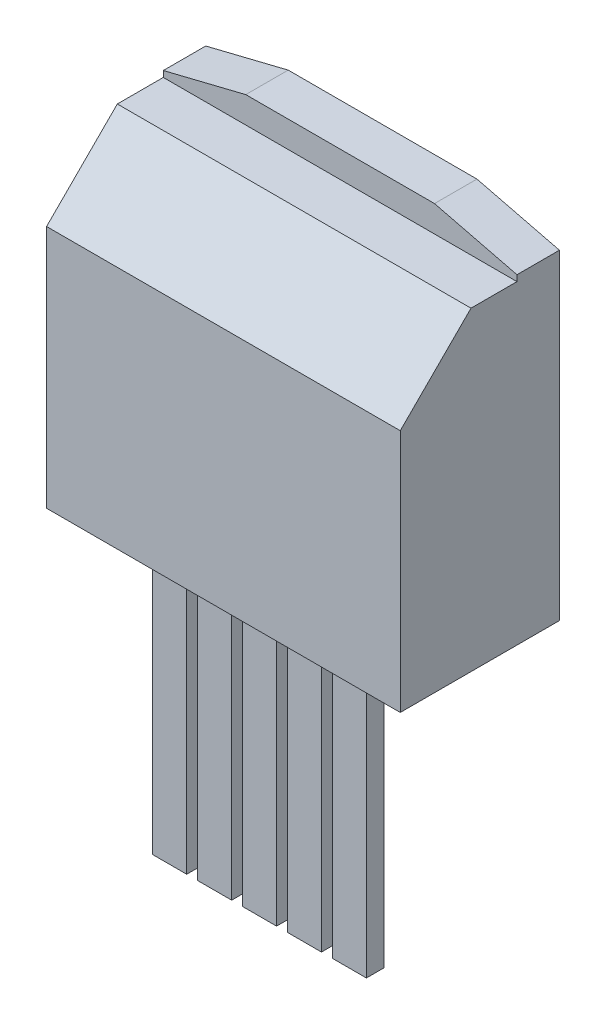
ISO-10303-21;
HEADER;
FILE_DESCRIPTION(('STEP AP214'),'2;1');
FILE_NAME('part.step','',(''),(''),'','','');
FILE_SCHEMA(('AUTOMOTIVE_DESIGN { 1 0 10303 214 1 1 1 1 }'));
ENDSEC;
DATA;
#1=APPLICATION_CONTEXT('core data for automotive mechanical design processes');
#2=APPLICATION_PROTOCOL_DEFINITION('international standard','automotive_design',2000,#1);
#3=PRODUCT_CONTEXT('',#1,'mechanical');
#4=PRODUCT('Part','Part','',(#3));
#5=PRODUCT_RELATED_PRODUCT_CATEGORY('part','',(#4));
#6=PRODUCT_DEFINITION_FORMATION('','',#4);
#7=PRODUCT_DEFINITION_CONTEXT('part definition',#1,'design');
#8=PRODUCT_DEFINITION('design','',#6,#7);
#9=PRODUCT_DEFINITION_SHAPE('','',#8);
#10=(LENGTH_UNIT() NAMED_UNIT(*) SI_UNIT(.MILLI.,.METRE.));
#11=(NAMED_UNIT(*) PLANE_ANGLE_UNIT() SI_UNIT($,.RADIAN.));
#12=(NAMED_UNIT(*) SI_UNIT($,.STERADIAN.) SOLID_ANGLE_UNIT());
#13=UNCERTAINTY_MEASURE_WITH_UNIT(LENGTH_MEASURE(1.E-05),#10,'distance_accuracy_value','');
#14=(GEOMETRIC_REPRESENTATION_CONTEXT(3) GLOBAL_UNCERTAINTY_ASSIGNED_CONTEXT((#13)) GLOBAL_UNIT_ASSIGNED_CONTEXT((#10,
#11,#12)) REPRESENTATION_CONTEXT('',''));
#15=CARTESIAN_POINT('',(0.,0.,0.));
#16=DIRECTION('',(0.,0.,1.));
#17=DIRECTION('',(1.,0.,0.));
#18=AXIS2_PLACEMENT_3D('',#15,#16,#17);
#19=CARTESIAN_POINT('',(-5.,0.,4.5));
#20=DIRECTION('',(0.,1.,0.));
#21=DIRECTION('',(-1.,0.,0.));
#22=AXIS2_PLACEMENT_3D('',#19,#20,#21);
#23=PLANE('',#22);
#24=DIRECTION('',(0.,0.,-1.));
#25=VECTOR('',#24,1.);
#26=CARTESIAN_POINT('',(-3.0227987588892,0.,3.47999999999991));
#27=LINE('',#26,#25);
#28=CARTESIAN_POINT('',(-3.0227987588892,0.,3.47999999999991));
#29=VERTEX_POINT('',#28);
#30=CARTESIAN_POINT('',(-3.0227987588892,0.,2.97999999999991));
#31=VERTEX_POINT('',#30);
#32=EDGE_CURVE('E248',#29,#31,#27,.T.);
#33=ORIENTED_EDGE('',*,*,#32,.F.);
#34=DIRECTION('',(-1.,0.,0.));
#35=VECTOR('',#34,1.);
#36=CARTESIAN_POINT('',(-3.0227987588892,0.,3.47999999999991));
#37=LINE('',#36,#35);
#38=CARTESIAN_POINT('',(-2.0572012411108,0.,3.47999999999991));
#39=VERTEX_POINT('',#38);
#40=EDGE_CURVE('E261',#39,#29,#37,.T.);
#41=ORIENTED_EDGE('',*,*,#40,.F.);
#42=DIRECTION('',(0.,0.,1.));
#43=VECTOR('',#42,1.);
#44=CARTESIAN_POINT('',(-2.0572012411108,0.,3.47999999999991));
#45=LINE('',#44,#43);
#46=CARTESIAN_POINT('',(-2.0572012411108,0.,2.97999999999991));
#47=VERTEX_POINT('',#46);
#48=EDGE_CURVE('E270',#47,#39,#45,.T.);
#49=ORIENTED_EDGE('',*,*,#48,.F.);
#50=DIRECTION('',(1.,0.,0.));
#51=VECTOR('',#50,1.);
#52=CARTESIAN_POINT('',(-3.0227987588892,0.,2.97999999999991));
#53=LINE('',#52,#51);
#54=EDGE_CURVE('E251',#31,#47,#53,.T.);
#55=ORIENTED_EDGE('',*,*,#54,.F.);
#56=EDGE_LOOP('',(#33,#41,#49,#55));
#57=FACE_BOUND('',#56,.T.);
#58=DIRECTION('',(0.,0.,-1.));
#59=VECTOR('',#58,1.);
#60=CARTESIAN_POINT('',(0.787201241110799,0.,3.48));
#61=LINE('',#60,#59);
#62=CARTESIAN_POINT('',(0.787201241110799,0.,3.48));
#63=VERTEX_POINT('',#62);
#64=CARTESIAN_POINT('',(0.787201241110798,0.,2.98));
#65=VERTEX_POINT('',#64);
#66=EDGE_CURVE('E319',#63,#65,#61,.T.);
#67=ORIENTED_EDGE('',*,*,#66,.F.);
#68=DIRECTION('',(-1.,0.,0.));
#69=VECTOR('',#68,1.);
#70=CARTESIAN_POINT('',(0.787201241110799,0.,3.48));
#71=LINE('',#70,#69);
#72=CARTESIAN_POINT('',(1.7527987588892,0.,3.48));
#73=VERTEX_POINT('',#72);
#74=EDGE_CURVE('E324',#73,#63,#71,.T.);
#75=ORIENTED_EDGE('',*,*,#74,.F.);
#76=DIRECTION('',(0.,0.,1.));
#77=VECTOR('',#76,1.);
#78=CARTESIAN_POINT('',(1.7527987588892,0.,3.48));
#79=LINE('',#78,#77);
#80=CARTESIAN_POINT('',(1.7527987588892,0.,2.98));
#81=VERTEX_POINT('',#80);
#82=EDGE_CURVE('E336',#81,#73,#79,.T.);
#83=ORIENTED_EDGE('',*,*,#82,.F.);
#84=DIRECTION('',(1.,0.,0.));
#85=VECTOR('',#84,1.);
#86=CARTESIAN_POINT('',(0.787201241110799,0.,2.98));
#87=LINE('',#86,#85);
#88=EDGE_CURVE('E333',#65,#81,#87,.T.);
#89=ORIENTED_EDGE('',*,*,#88,.F.);
#90=EDGE_LOOP('',(#67,#75,#83,#89));
#91=FACE_BOUND('',#90,.T.);
#92=DIRECTION('',(1.,0.,0.));
#93=VECTOR('',#92,1.);
#94=CARTESIAN_POINT('',(-5.,0.,0.));
#95=LINE('',#94,#93);
#96=CARTESIAN_POINT('',(-5.,0.,0.));
#97=VERTEX_POINT('',#96);
#98=CARTESIAN_POINT('',(5.,0.,0.));
#99=VERTEX_POINT('',#98);
#100=EDGE_CURVE('E435',#97,#99,#95,.T.);
#101=ORIENTED_EDGE('',*,*,#100,.T.);
#102=DIRECTION('',(0.,0.,-1.));
#103=VECTOR('',#102,1.);
#104=CARTESIAN_POINT('',(5.,0.,4.5));
#105=LINE('',#104,#103);
#106=CARTESIAN_POINT('',(5.,0.,4.5));
#107=VERTEX_POINT('',#106);
#108=EDGE_CURVE('E433',#107,#99,#105,.T.);
#109=ORIENTED_EDGE('',*,*,#108,.F.);
#110=DIRECTION('',(1.,0.,0.));
#111=VECTOR('',#110,1.);
#112=CARTESIAN_POINT('',(-5.,0.,4.5));
#113=LINE('',#112,#111);
#114=CARTESIAN_POINT('',(-5.,0.,4.5));
#115=VERTEX_POINT('',#114);
#116=EDGE_CURVE('E427',#115,#107,#113,.T.);
#117=ORIENTED_EDGE('',*,*,#116,.F.);
#118=DIRECTION('',(0.,0.,-1.));
#119=VECTOR('',#118,1.);
#120=CARTESIAN_POINT('',(-5.,0.,4.5));
#121=LINE('',#120,#119);
#122=EDGE_CURVE('E441',#115,#97,#121,.T.);
#123=ORIENTED_EDGE('',*,*,#122,.T.);
#124=EDGE_LOOP('',(#101,#109,#117,#123));
#125=FACE_BOUND('',#124,.T.);
#126=DIRECTION('',(0.,0.,-1.));
#127=VECTOR('',#126,1.);
#128=CARTESIAN_POINT('',(-0.482798758889201,0.,3.48));
#129=LINE('',#128,#127);
#130=CARTESIAN_POINT('',(-0.482798758889201,0.,3.48));
#131=VERTEX_POINT('',#130);
#132=CARTESIAN_POINT('',(-0.482798758889201,0.,2.98));
#133=VERTEX_POINT('',#132);
#134=EDGE_CURVE('E352',#131,#133,#129,.T.);
#135=ORIENTED_EDGE('',*,*,#134,.F.);
#136=DIRECTION('',(-1.,0.,0.));
#137=VECTOR('',#136,1.);
#138=CARTESIAN_POINT('',(-0.482798758889201,0.,3.48));
#139=LINE('',#138,#137);
#140=CARTESIAN_POINT('',(0.482798758889203,0.,3.48));
#141=VERTEX_POINT('',#140);
#142=EDGE_CURVE('E357',#141,#131,#139,.T.);
#143=ORIENTED_EDGE('',*,*,#142,.F.);
#144=DIRECTION('',(0.,0.,1.));
#145=VECTOR('',#144,1.);
#146=CARTESIAN_POINT('',(0.482798758889201,0.,3.48));
#147=LINE('',#146,#145);
#148=CARTESIAN_POINT('',(0.482798758889201,0.,2.98));
#149=VERTEX_POINT('',#148);
#150=EDGE_CURVE('E369',#149,#141,#147,.T.);
#151=ORIENTED_EDGE('',*,*,#150,.F.);
#152=DIRECTION('',(1.,0.,0.));
#153=VECTOR('',#152,1.);
#154=CARTESIAN_POINT('',(-0.482798758889201,0.,2.98));
#155=LINE('',#154,#153);
#156=EDGE_CURVE('E366',#133,#149,#155,.T.);
#157=ORIENTED_EDGE('',*,*,#156,.F.);
#158=EDGE_LOOP('',(#135,#143,#151,#157));
#159=FACE_BOUND('',#158,.T.);
#160=DIRECTION('',(0.,0.,-1.));
#161=VECTOR('',#160,1.);
#162=CARTESIAN_POINT('',(-1.7527987588892,0.,3.47999999999996));
#163=LINE('',#162,#161);
#164=CARTESIAN_POINT('',(-1.7527987588892,0.,3.47999999999996));
#165=VERTEX_POINT('',#164);
#166=CARTESIAN_POINT('',(-1.7527987588892,0.,2.97999999999996));
#167=VERTEX_POINT('',#166);
#168=EDGE_CURVE('E286',#165,#167,#163,.T.);
#169=ORIENTED_EDGE('',*,*,#168,.F.);
#170=DIRECTION('',(-1.,0.,0.));
#171=VECTOR('',#170,1.);
#172=CARTESIAN_POINT('',(-1.7527987588892,0.,3.47999999999996));
#173=LINE('',#172,#171);
#174=CARTESIAN_POINT('',(-0.787201241110797,0.,3.47999999999996));
#175=VERTEX_POINT('',#174);
#176=EDGE_CURVE('E291',#175,#165,#173,.T.);
#177=ORIENTED_EDGE('',*,*,#176,.F.);
#178=DIRECTION('',(0.,0.,1.));
#179=VECTOR('',#178,1.);
#180=CARTESIAN_POINT('',(-0.787201241110799,0.,3.47999999999996));
#181=LINE('',#180,#179);
#182=CARTESIAN_POINT('',(-0.787201241110799,0.,2.97999999999996));
#183=VERTEX_POINT('',#182);
#184=EDGE_CURVE('E303',#183,#175,#181,.T.);
#185=ORIENTED_EDGE('',*,*,#184,.F.);
#186=DIRECTION('',(1.,0.,0.));
#187=VECTOR('',#186,1.);
#188=CARTESIAN_POINT('',(-1.7527987588892,0.,2.97999999999996));
#189=LINE('',#188,#187);
#190=EDGE_CURVE('E300',#167,#183,#189,.T.);
#191=ORIENTED_EDGE('',*,*,#190,.F.);
#192=EDGE_LOOP('',(#169,#177,#185,#191));
#193=FACE_BOUND('',#192,.T.);
#194=DIRECTION('',(0.,0.,-1.));
#195=VECTOR('',#194,1.);
#196=CARTESIAN_POINT('',(2.0572012411108,0.,3.48));
#197=LINE('',#196,#195);
#198=CARTESIAN_POINT('',(2.0572012411108,0.,3.48));
#199=VERTEX_POINT('',#198);
#200=CARTESIAN_POINT('',(2.0572012411108,0.,2.98));
#201=VERTEX_POINT('',#200);
#202=EDGE_CURVE('E247',#199,#201,#197,.T.);
#203=ORIENTED_EDGE('',*,*,#202,.F.);
#204=DIRECTION('',(-1.,0.,0.));
#205=VECTOR('',#204,1.);
#206=CARTESIAN_POINT('',(2.0572012411108,0.,3.48));
#207=LINE('',#206,#205);
#208=CARTESIAN_POINT('',(3.0227987588892,0.,3.48));
#209=VERTEX_POINT('',#208);
#210=EDGE_CURVE('E244',#209,#199,#207,.T.);
#211=ORIENTED_EDGE('',*,*,#210,.F.);
#212=DIRECTION('',(0.,0.,1.));
#213=VECTOR('',#212,1.);
#214=CARTESIAN_POINT('',(3.0227987588892,0.,3.48));
#215=LINE('',#214,#213);
#216=CARTESIAN_POINT('',(3.0227987588892,0.,2.98));
#217=VERTEX_POINT('',#216);
#218=EDGE_CURVE('E57',#217,#209,#215,.T.);
#219=ORIENTED_EDGE('',*,*,#218,.F.);
#220=DIRECTION('',(1.,0.,0.));
#221=VECTOR('',#220,1.);
#222=CARTESIAN_POINT('',(2.0572012411108,0.,2.98));
#223=LINE('',#222,#221);
#224=EDGE_CURVE('E52',#201,#217,#223,.T.);
#225=ORIENTED_EDGE('',*,*,#224,.F.);
#226=EDGE_LOOP('',(#203,#211,#219,#225));
#227=FACE_BOUND('',#226,.T.);
#228=ADVANCED_FACE('F37',(#57,#91,#125,#159,#193,#227),#23,.F.);
#229=CARTESIAN_POINT('',(-4.99999999999999,15.4,4.5));
#230=DIRECTION('',(1.,0.,0.));
#231=DIRECTION('',(0.,1.,0.));
#232=AXIS2_PLACEMENT_3D('',#229,#230,#231);
#233=PLANE('',#232);
#234=DIRECTION('',(0.,1.,0.));
#235=VECTOR('',#234,1.);
#236=CARTESIAN_POINT('',(-4.99999999999999,15.4,1.2));
#237=LINE('',#236,#235);
#238=CARTESIAN_POINT('',(-4.99999999999999,8.9,1.2));
#239=VERTEX_POINT('',#238);
#240=CARTESIAN_POINT('',(-5.,9.06956973121704,1.2));
#241=VERTEX_POINT('',#240);
#242=EDGE_CURVE('E414',#239,#241,#237,.T.);
#243=ORIENTED_EDGE('',*,*,#242,.T.);
#244=DIRECTION('',(0.,0.,1.));
#245=VECTOR('',#244,1.);
#246=CARTESIAN_POINT('',(-4.99999999999999,9.06956973121704,-8.8));
#247=LINE('',#246,#245);
#248=CARTESIAN_POINT('',(-4.99999999999999,9.06956973121704,0.));
#249=VERTEX_POINT('',#248);
#250=EDGE_CURVE('E393',#249,#241,#247,.T.);
#251=ORIENTED_EDGE('',*,*,#250,.F.);
#252=DIRECTION('',(0.,-1.,0.));
#253=VECTOR('',#252,1.);
#254=CARTESIAN_POINT('',(-4.99999999999999,15.4,0.));
#255=LINE('',#254,#253);
#256=EDGE_CURVE('E424',#249,#97,#255,.T.);
#257=ORIENTED_EDGE('',*,*,#256,.T.);
#258=ORIENTED_EDGE('',*,*,#122,.F.);
#259=DIRECTION('',(0.,-1.,0.));
#260=VECTOR('',#259,1.);
#261=CARTESIAN_POINT('',(-4.99999999999999,15.4,4.5));
#262=LINE('',#261,#260);
#263=CARTESIAN_POINT('',(-5.,6.89999999999999,4.5));
#264=VERTEX_POINT('',#263);
#265=EDGE_CURVE('E425',#264,#115,#262,.T.);
#266=ORIENTED_EDGE('',*,*,#265,.F.);
#267=DIRECTION('',(0.,0.707106781186549,-0.707106781186546));
#268=VECTOR('',#267,1.);
#269=CARTESIAN_POINT('',(-5.,8.9,2.5));
#270=LINE('',#269,#268);
#271=CARTESIAN_POINT('',(-5.,8.9,2.49999999999999));
#272=VERTEX_POINT('',#271);
#273=EDGE_CURVE('E12',#264,#272,#270,.T.);
#274=ORIENTED_EDGE('',*,*,#273,.T.);
#275=DIRECTION('',(0.,0.,1.));
#276=VECTOR('',#275,1.);
#277=CARTESIAN_POINT('',(-4.99999999999999,8.9,-11.9268604418766));
#278=LINE('',#277,#276);
#279=EDGE_CURVE('E411',#239,#272,#278,.T.);
#280=ORIENTED_EDGE('',*,*,#279,.F.);
#281=EDGE_LOOP('',(#243,#251,#257,#258,#266,#274,#280));
#282=FACE_BOUND('',#281,.T.);
#283=ADVANCED_FACE('F458',(#282),#233,.F.);
#284=CARTESIAN_POINT('',(5.,15.4,4.5));
#285=DIRECTION('',(-1.,0.,0.));
#286=DIRECTION('',(0.,-1.,0.));
#287=AXIS2_PLACEMENT_3D('',#284,#285,#286);
#288=PLANE('',#287);
#289=DIRECTION('',(0.,1.,0.));
#290=VECTOR('',#289,1.);
#291=CARTESIAN_POINT('',(5.,15.4,0.));
#292=LINE('',#291,#290);
#293=CARTESIAN_POINT('',(4.99999999999999,9.06956973121704,0.));
#294=VERTEX_POINT('',#293);
#295=EDGE_CURVE('E428',#99,#294,#292,.T.);
#296=ORIENTED_EDGE('',*,*,#295,.T.);
#297=DIRECTION('',(0.,0.,1.));
#298=VECTOR('',#297,1.);
#299=CARTESIAN_POINT('',(4.99999999999999,9.06956973121704,-8.8));
#300=LINE('',#299,#298);
#301=CARTESIAN_POINT('',(4.99999999999999,9.06956973121704,1.2));
#302=VERTEX_POINT('',#301);
#303=EDGE_CURVE('E394',#294,#302,#300,.T.);
#304=ORIENTED_EDGE('',*,*,#303,.T.);
#305=DIRECTION('',(0.,-1.,0.));
#306=VECTOR('',#305,1.);
#307=CARTESIAN_POINT('',(5.,15.4,1.2));
#308=LINE('',#307,#306);
#309=CARTESIAN_POINT('',(5.,8.9,1.2));
#310=VERTEX_POINT('',#309);
#311=EDGE_CURVE('E412',#302,#310,#308,.T.);
#312=ORIENTED_EDGE('',*,*,#311,.T.);
#313=DIRECTION('',(0.,0.,1.));
#314=VECTOR('',#313,1.);
#315=CARTESIAN_POINT('',(5.,8.9,-11.9268604418766));
#316=LINE('',#315,#314);
#317=CARTESIAN_POINT('',(5.,8.9,2.49999999999999));
#318=VERTEX_POINT('',#317);
#319=EDGE_CURVE('E415',#310,#318,#316,.T.);
#320=ORIENTED_EDGE('',*,*,#319,.T.);
#321=DIRECTION('',(0.,-0.707106781186549,0.707106781186546));
#322=VECTOR('',#321,1.);
#323=CARTESIAN_POINT('',(5.,8.9,2.5));
#324=LINE('',#323,#322);
#325=CARTESIAN_POINT('',(5.,6.89999999999999,4.5));
#326=VERTEX_POINT('',#325);
#327=EDGE_CURVE('E447',#318,#326,#324,.T.);
#328=ORIENTED_EDGE('',*,*,#327,.T.);
#329=DIRECTION('',(0.,1.,0.));
#330=VECTOR('',#329,1.);
#331=CARTESIAN_POINT('',(5.,15.4,4.5));
#332=LINE('',#331,#330);
#333=EDGE_CURVE('E430',#107,#326,#332,.T.);
#334=ORIENTED_EDGE('',*,*,#333,.F.);
#335=ORIENTED_EDGE('',*,*,#108,.T.);
#336=EDGE_LOOP('',(#296,#304,#312,#320,#328,#334,#335));
#337=FACE_BOUND('',#336,.T.);
#338=ADVANCED_FACE('F466',(#337),#288,.F.);
#339=CARTESIAN_POINT('',(0.,0.,4.5));
#340=DIRECTION('',(0.,0.,1.));
#341=DIRECTION('',(1.,0.,0.));
#342=AXIS2_PLACEMENT_3D('',#339,#340,#341);
#343=PLANE('',#342);
#344=ORIENTED_EDGE('',*,*,#333,.T.);
#345=DIRECTION('',(-1.,0.,0.));
#346=VECTOR('',#345,1.);
#347=CARTESIAN_POINT('',(-5.,6.89999999999999,4.5));
#348=LINE('',#347,#346);
#349=EDGE_CURVE('E45',#326,#264,#348,.T.);
#350=ORIENTED_EDGE('',*,*,#349,.T.);
#351=ORIENTED_EDGE('',*,*,#265,.T.);
#352=ORIENTED_EDGE('',*,*,#116,.T.);
#353=EDGE_LOOP('',(#344,#350,#351,#352));
#354=FACE_BOUND('',#353,.T.);
#355=ADVANCED_FACE('F451',(#354),#343,.T.);
#356=CARTESIAN_POINT('',(0.,0.,0.));
#357=DIRECTION('',(0.,0.,1.));
#358=DIRECTION('',(1.,0.,0.));
#359=AXIS2_PLACEMENT_3D('',#356,#357,#358);
#360=PLANE('',#359);
#361=DIRECTION('',(1.,0.,0.));
#362=VECTOR('',#361,1.);
#363=CARTESIAN_POINT('',(0.,9.64535654457429,0.));
#364=LINE('',#363,#362);
#365=CARTESIAN_POINT('',(-2.66802514635821,9.64535654457429,0.));
#366=VERTEX_POINT('',#365);
#367=CARTESIAN_POINT('',(2.66802514635821,9.64535654457429,0.));
#368=VERTEX_POINT('',#367);
#369=EDGE_CURVE('E405',#366,#368,#364,.T.);
#370=ORIENTED_EDGE('',*,*,#369,.T.);
#371=DIRECTION('',(0.970844358785444,-0.239710723611775,0.));
#372=VECTOR('',#371,1.);
#373=CARTESIAN_POINT('',(2.39799278223807,9.71203010848397,0.));
#374=LINE('',#373,#372);
#375=EDGE_CURVE('E408',#368,#294,#374,.T.);
#376=ORIENTED_EDGE('',*,*,#375,.T.);
#377=ORIENTED_EDGE('',*,*,#295,.F.);
#378=ORIENTED_EDGE('',*,*,#100,.F.);
#379=ORIENTED_EDGE('',*,*,#256,.F.);
#380=DIRECTION('',(0.970844358785444,0.239710723611775,0.));
#381=VECTOR('',#380,1.);
#382=CARTESIAN_POINT('',(-2.39799278223807,9.71203010848397,0.));
#383=LINE('',#382,#381);
#384=EDGE_CURVE('E397',#249,#366,#383,.T.);
#385=ORIENTED_EDGE('',*,*,#384,.T.);
#386=EDGE_LOOP('',(#370,#376,#377,#378,#379,#385));
#387=FACE_BOUND('',#386,.T.);
#388=ADVANCED_FACE('F479',(#387),#360,.F.);
#389=CARTESIAN_POINT('',(-4.99999999999999,8.9,-11.9268604418766));
#390=DIRECTION('',(0.,-1.,0.));
#391=DIRECTION('',(0.,0.,-1.));
#392=AXIS2_PLACEMENT_3D('',#389,#390,#391);
#393=PLANE('',#392);
#394=ORIENTED_EDGE('',*,*,#279,.T.);
#395=DIRECTION('',(1.,0.,0.));
#396=VECTOR('',#395,1.);
#397=CARTESIAN_POINT('',(5.,8.9,2.5));
#398=LINE('',#397,#396);
#399=EDGE_CURVE('E444',#272,#318,#398,.T.);
#400=ORIENTED_EDGE('',*,*,#399,.T.);
#401=ORIENTED_EDGE('',*,*,#319,.F.);
#402=DIRECTION('',(-1.,0.,0.));
#403=VECTOR('',#402,1.);
#404=CARTESIAN_POINT('',(-4.99999999999999,8.9,1.2));
#405=LINE('',#404,#403);
#406=EDGE_CURVE('E418',#310,#239,#405,.T.);
#407=ORIENTED_EDGE('',*,*,#406,.T.);
#408=EDGE_LOOP('',(#394,#400,#401,#407));
#409=FACE_BOUND('',#408,.T.);
#410=ADVANCED_FACE('F463',(#409),#393,.F.);
#411=CARTESIAN_POINT('',(0.,0.,1.2));
#412=DIRECTION('',(0.,0.,1.));
#413=DIRECTION('',(1.,0.,0.));
#414=AXIS2_PLACEMENT_3D('',#411,#412,#413);
#415=PLANE('',#414);
#416=DIRECTION('',(0.970844358785444,-0.239710723611775,0.));
#417=VECTOR('',#416,1.);
#418=CARTESIAN_POINT('',(4.99999999999999,9.06956973121704,1.2));
#419=LINE('',#418,#417);
#420=CARTESIAN_POINT('',(2.66802514635821,9.64535654457429,1.2));
#421=VERTEX_POINT('',#420);
#422=EDGE_CURVE('E391',#421,#302,#419,.T.);
#423=ORIENTED_EDGE('',*,*,#422,.F.);
#424=DIRECTION('',(1.,0.,0.));
#425=VECTOR('',#424,1.);
#426=CARTESIAN_POINT('',(-2.66802514635821,9.64535654457429,1.2));
#427=LINE('',#426,#425);
#428=CARTESIAN_POINT('',(-2.66802514635821,9.64535654457429,1.2));
#429=VERTEX_POINT('',#428);
#430=EDGE_CURVE('E388',#429,#421,#427,.T.);
#431=ORIENTED_EDGE('',*,*,#430,.F.);
#432=DIRECTION('',(0.970844358785444,0.239710723611775,0.));
#433=VECTOR('',#432,1.);
#434=CARTESIAN_POINT('',(-4.99999999999999,9.06956973121704,1.2));
#435=LINE('',#434,#433);
#436=EDGE_CURVE('E385',#241,#429,#435,.T.);
#437=ORIENTED_EDGE('',*,*,#436,.F.);
#438=ORIENTED_EDGE('',*,*,#242,.F.);
#439=ORIENTED_EDGE('',*,*,#406,.F.);
#440=ORIENTED_EDGE('',*,*,#311,.F.);
#441=EDGE_LOOP('',(#423,#431,#437,#438,#439,#440));
#442=FACE_BOUND('',#441,.T.);
#443=ADVANCED_FACE('F470',(#442),#415,.T.);
#444=CARTESIAN_POINT('',(-4.99999999999999,8.9,2.5));
#445=DIRECTION('',(0.,0.707106781186546,0.707106781186549));
#446=DIRECTION('',(-1.,0.,0.));
#447=AXIS2_PLACEMENT_3D('',#444,#445,#446);
#448=PLANE('',#447);
#449=ORIENTED_EDGE('',*,*,#273,.F.);
#450=ORIENTED_EDGE('',*,*,#349,.F.);
#451=ORIENTED_EDGE('',*,*,#327,.F.);
#452=ORIENTED_EDGE('',*,*,#399,.F.);
#453=EDGE_LOOP('',(#449,#450,#451,#452));
#454=FACE_BOUND('',#453,.T.);
#455=ADVANCED_FACE('F39',(#454),#448,.T.);
#456=CARTESIAN_POINT('',(4.99999999999999,9.06956973121704,-8.8));
#457=DIRECTION('',(-0.239710723611775,-0.970844358785444,0.));
#458=DIRECTION('',(0.970844358785444,-0.239710723611775,0.));
#459=AXIS2_PLACEMENT_3D('',#456,#457,#458);
#460=PLANE('',#459);
#461=DIRECTION('',(0.,0.,1.));
#462=VECTOR('',#461,1.);
#463=CARTESIAN_POINT('',(2.66802514635821,9.64535654457429,-8.8));
#464=LINE('',#463,#462);
#465=EDGE_CURVE('E398',#368,#421,#464,.T.);
#466=ORIENTED_EDGE('',*,*,#465,.T.);
#467=ORIENTED_EDGE('',*,*,#422,.T.);
#468=ORIENTED_EDGE('',*,*,#303,.F.);
#469=ORIENTED_EDGE('',*,*,#375,.F.);
#470=EDGE_LOOP('',(#466,#467,#468,#469));
#471=FACE_BOUND('',#470,.T.);
#472=ADVANCED_FACE('F596',(#471),#460,.F.);
#473=CARTESIAN_POINT('',(-2.66802514635821,9.64535654457429,-8.8));
#474=DIRECTION('',(0.,-1.,0.));
#475=DIRECTION('',(0.,0.,-1.));
#476=AXIS2_PLACEMENT_3D('',#473,#474,#475);
#477=PLANE('',#476);
#478=DIRECTION('',(0.,0.,1.));
#479=VECTOR('',#478,1.);
#480=CARTESIAN_POINT('',(-2.66802514635821,9.64535654457429,-8.8));
#481=LINE('',#480,#479);
#482=EDGE_CURVE('E400',#366,#429,#481,.T.);
#483=ORIENTED_EDGE('',*,*,#482,.T.);
#484=ORIENTED_EDGE('',*,*,#430,.T.);
#485=ORIENTED_EDGE('',*,*,#465,.F.);
#486=ORIENTED_EDGE('',*,*,#369,.F.);
#487=EDGE_LOOP('',(#483,#484,#485,#486));
#488=FACE_BOUND('',#487,.T.);
#489=ADVANCED_FACE('F599',(#488),#477,.F.);
#490=CARTESIAN_POINT('',(-4.99999999999999,9.06956973121704,-8.8));
#491=DIRECTION('',(0.239710723611775,-0.970844358785444,0.));
#492=DIRECTION('',(0.970844358785444,0.239710723611775,0.));
#493=AXIS2_PLACEMENT_3D('',#490,#491,#492);
#494=PLANE('',#493);
#495=ORIENTED_EDGE('',*,*,#250,.T.);
#496=ORIENTED_EDGE('',*,*,#436,.T.);
#497=ORIENTED_EDGE('',*,*,#482,.F.);
#498=ORIENTED_EDGE('',*,*,#384,.F.);
#499=EDGE_LOOP('',(#495,#496,#497,#498));
#500=FACE_BOUND('',#499,.T.);
#501=ADVANCED_FACE('F594',(#500),#494,.F.);
#502=CARTESIAN_POINT('',(-0.4827987588892,-8.,3.48));
#503=DIRECTION('',(1.,0.,0.));
#504=DIRECTION('',(0.,1.,0.));
#505=AXIS2_PLACEMENT_3D('',#502,#503,#504);
#506=PLANE('',#505);
#507=ORIENTED_EDGE('',*,*,#134,.T.);
#508=DIRECTION('',(0.,1.,0.));
#509=VECTOR('',#508,1.);
#510=CARTESIAN_POINT('',(-0.4827987588892,-8.,2.98));
#511=LINE('',#510,#509);
#512=CARTESIAN_POINT('',(-0.4827987588892,-8.,2.98));
#513=VERTEX_POINT('',#512);
#514=EDGE_CURVE('E382',#513,#133,#511,.T.);
#515=ORIENTED_EDGE('',*,*,#514,.F.);
#516=DIRECTION('',(0.,0.,-1.));
#517=VECTOR('',#516,1.);
#518=CARTESIAN_POINT('',(-0.4827987588892,-8.,3.48));
#519=LINE('',#518,#517);
#520=CARTESIAN_POINT('',(-0.4827987588892,-8.,3.48));
#521=VERTEX_POINT('',#520);
#522=EDGE_CURVE('E353',#521,#513,#519,.T.);
#523=ORIENTED_EDGE('',*,*,#522,.F.);
#524=DIRECTION('',(0.,1.,0.));
#525=VECTOR('',#524,1.);
#526=CARTESIAN_POINT('',(-0.4827987588892,-8.,3.48));
#527=LINE('',#526,#525);
#528=EDGE_CURVE('E363',#521,#131,#527,.T.);
#529=ORIENTED_EDGE('',*,*,#528,.T.);
#530=EDGE_LOOP('',(#507,#515,#523,#529));
#531=FACE_BOUND('',#530,.T.);
#532=ADVANCED_FACE('F590',(#531),#506,.F.);
#533=CARTESIAN_POINT('',(-0.4827987588892,-8.,2.98));
#534=DIRECTION('',(0.,0.,1.));
#535=DIRECTION('',(1.,0.,0.));
#536=AXIS2_PLACEMENT_3D('',#533,#534,#535);
#537=PLANE('',#536);
#538=ORIENTED_EDGE('',*,*,#156,.T.);
#539=DIRECTION('',(0.,1.,0.));
#540=VECTOR('',#539,1.);
#541=CARTESIAN_POINT('',(0.482798758889202,-8.,2.98));
#542=LINE('',#541,#540);
#543=CARTESIAN_POINT('',(0.482798758889202,-8.,2.98));
#544=VERTEX_POINT('',#543);
#545=EDGE_CURVE('E379',#544,#149,#542,.T.);
#546=ORIENTED_EDGE('',*,*,#545,.F.);
#547=DIRECTION('',(1.,0.,0.));
#548=VECTOR('',#547,1.);
#549=CARTESIAN_POINT('',(-0.4827987588892,-8.,2.98));
#550=LINE('',#549,#548);
#551=EDGE_CURVE('E356',#513,#544,#550,.T.);
#552=ORIENTED_EDGE('',*,*,#551,.F.);
#553=ORIENTED_EDGE('',*,*,#514,.T.);
#554=EDGE_LOOP('',(#538,#546,#552,#553));
#555=FACE_BOUND('',#554,.T.);
#556=ADVANCED_FACE('F586',(#555),#537,.F.);
#557=CARTESIAN_POINT('',(0.482798758889202,-8.,3.48));
#558=DIRECTION('',(-1.,0.,0.));
#559=DIRECTION('',(0.,-1.,0.));
#560=AXIS2_PLACEMENT_3D('',#557,#558,#559);
#561=PLANE('',#560);
#562=ORIENTED_EDGE('',*,*,#150,.T.);
#563=DIRECTION('',(0.,1.,0.));
#564=VECTOR('',#563,1.);
#565=CARTESIAN_POINT('',(0.482798758889202,-8.,3.48));
#566=LINE('',#565,#564);
#567=CARTESIAN_POINT('',(0.482798758889202,-8.,3.48));
#568=VERTEX_POINT('',#567);
#569=EDGE_CURVE('E376',#568,#141,#566,.T.);
#570=ORIENTED_EDGE('',*,*,#569,.F.);
#571=DIRECTION('',(0.,0.,1.));
#572=VECTOR('',#571,1.);
#573=CARTESIAN_POINT('',(0.482798758889202,-8.,3.48));
#574=LINE('',#573,#572);
#575=EDGE_CURVE('E359',#544,#568,#574,.T.);
#576=ORIENTED_EDGE('',*,*,#575,.F.);
#577=ORIENTED_EDGE('',*,*,#545,.T.);
#578=EDGE_LOOP('',(#562,#570,#576,#577));
#579=FACE_BOUND('',#578,.T.);
#580=ADVANCED_FACE('F582',(#579),#561,.F.);
#581=CARTESIAN_POINT('',(-0.4827987588892,-8.,3.48));
#582=DIRECTION('',(0.,0.,-1.));
#583=DIRECTION('',(-1.,0.,0.));
#584=AXIS2_PLACEMENT_3D('',#581,#582,#583);
#585=PLANE('',#584);
#586=ORIENTED_EDGE('',*,*,#142,.T.);
#587=ORIENTED_EDGE('',*,*,#528,.F.);
#588=DIRECTION('',(-1.,0.,0.));
#589=VECTOR('',#588,1.);
#590=CARTESIAN_POINT('',(-0.4827987588892,-8.,3.48));
#591=LINE('',#590,#589);
#592=EDGE_CURVE('E361',#568,#521,#591,.T.);
#593=ORIENTED_EDGE('',*,*,#592,.F.);
#594=ORIENTED_EDGE('',*,*,#569,.T.);
#595=EDGE_LOOP('',(#586,#587,#593,#594));
#596=FACE_BOUND('',#595,.T.);
#597=ADVANCED_FACE('F578',(#596),#585,.F.);
#598=CARTESIAN_POINT('',(0.,-8.,0.));
#599=DIRECTION('',(0.,-1.,0.));
#600=DIRECTION('',(1.,0.,0.));
#601=AXIS2_PLACEMENT_3D('',#598,#599,#600);
#602=PLANE('',#601);
#603=ORIENTED_EDGE('',*,*,#522,.T.);
#604=ORIENTED_EDGE('',*,*,#551,.T.);
#605=ORIENTED_EDGE('',*,*,#575,.T.);
#606=ORIENTED_EDGE('',*,*,#592,.T.);
#607=EDGE_LOOP('',(#603,#604,#605,#606));
#608=FACE_BOUND('',#607,.T.);
#609=ADVANCED_FACE('F574',(#608),#602,.T.);
#610=CARTESIAN_POINT('',(0.7872012411108,-8.,3.48));
#611=DIRECTION('',(1.,0.,0.));
#612=DIRECTION('',(0.,1.,0.));
#613=AXIS2_PLACEMENT_3D('',#610,#611,#612);
#614=PLANE('',#613);
#615=ORIENTED_EDGE('',*,*,#66,.T.);
#616=DIRECTION('',(0.,1.,0.));
#617=VECTOR('',#616,1.);
#618=CARTESIAN_POINT('',(0.7872012411108,-8.,2.98));
#619=LINE('',#618,#617);
#620=CARTESIAN_POINT('',(0.7872012411108,-8.,2.98));
#621=VERTEX_POINT('',#620);
#622=EDGE_CURVE('E349',#621,#65,#619,.T.);
#623=ORIENTED_EDGE('',*,*,#622,.F.);
#624=DIRECTION('',(0.,0.,-1.));
#625=VECTOR('',#624,1.);
#626=CARTESIAN_POINT('',(0.7872012411108,-8.,3.48));
#627=LINE('',#626,#625);
#628=CARTESIAN_POINT('',(0.7872012411108,-8.,3.48));
#629=VERTEX_POINT('',#628);
#630=EDGE_CURVE('E320',#629,#621,#627,.T.);
#631=ORIENTED_EDGE('',*,*,#630,.F.);
#632=DIRECTION('',(0.,1.,0.));
#633=VECTOR('',#632,1.);
#634=CARTESIAN_POINT('',(0.7872012411108,-8.,3.48));
#635=LINE('',#634,#633);
#636=EDGE_CURVE('E330',#629,#63,#635,.T.);
#637=ORIENTED_EDGE('',*,*,#636,.T.);
#638=EDGE_LOOP('',(#615,#623,#631,#637));
#639=FACE_BOUND('',#638,.T.);
#640=ADVANCED_FACE('F570',(#639),#614,.F.);
#641=CARTESIAN_POINT('',(0.7872012411108,-8.,2.98));
#642=DIRECTION('',(0.,0.,1.));
#643=DIRECTION('',(1.,0.,0.));
#644=AXIS2_PLACEMENT_3D('',#641,#642,#643);
#645=PLANE('',#644);
#646=ORIENTED_EDGE('',*,*,#88,.T.);
#647=DIRECTION('',(0.,1.,0.));
#648=VECTOR('',#647,1.);
#649=CARTESIAN_POINT('',(1.7527987588892,-8.,2.98));
#650=LINE('',#649,#648);
#651=CARTESIAN_POINT('',(1.7527987588892,-8.,2.98));
#652=VERTEX_POINT('',#651);
#653=EDGE_CURVE('E346',#652,#81,#650,.T.);
#654=ORIENTED_EDGE('',*,*,#653,.F.);
#655=DIRECTION('',(1.,0.,0.));
#656=VECTOR('',#655,1.);
#657=CARTESIAN_POINT('',(0.7872012411108,-8.,2.98));
#658=LINE('',#657,#656);
#659=EDGE_CURVE('E323',#621,#652,#658,.T.);
#660=ORIENTED_EDGE('',*,*,#659,.F.);
#661=ORIENTED_EDGE('',*,*,#622,.T.);
#662=EDGE_LOOP('',(#646,#654,#660,#661));
#663=FACE_BOUND('',#662,.T.);
#664=ADVANCED_FACE('F566',(#663),#645,.F.);
#665=CARTESIAN_POINT('',(1.7527987588892,-8.,3.48));
#666=DIRECTION('',(-1.,0.,0.));
#667=DIRECTION('',(0.,-1.,0.));
#668=AXIS2_PLACEMENT_3D('',#665,#666,#667);
#669=PLANE('',#668);
#670=ORIENTED_EDGE('',*,*,#82,.T.);
#671=DIRECTION('',(0.,1.,0.));
#672=VECTOR('',#671,1.);
#673=CARTESIAN_POINT('',(1.7527987588892,-8.,3.48));
#674=LINE('',#673,#672);
#675=CARTESIAN_POINT('',(1.7527987588892,-8.,3.48));
#676=VERTEX_POINT('',#675);
#677=EDGE_CURVE('E343',#676,#73,#674,.T.);
#678=ORIENTED_EDGE('',*,*,#677,.F.);
#679=DIRECTION('',(0.,0.,1.));
#680=VECTOR('',#679,1.);
#681=CARTESIAN_POINT('',(1.7527987588892,-8.,3.48));
#682=LINE('',#681,#680);
#683=EDGE_CURVE('E326',#652,#676,#682,.T.);
#684=ORIENTED_EDGE('',*,*,#683,.F.);
#685=ORIENTED_EDGE('',*,*,#653,.T.);
#686=EDGE_LOOP('',(#670,#678,#684,#685));
#687=FACE_BOUND('',#686,.T.);
#688=ADVANCED_FACE('F562',(#687),#669,.F.);
#689=CARTESIAN_POINT('',(0.7872012411108,-8.,3.48));
#690=DIRECTION('',(0.,0.,-1.));
#691=DIRECTION('',(-1.,0.,0.));
#692=AXIS2_PLACEMENT_3D('',#689,#690,#691);
#693=PLANE('',#692);
#694=ORIENTED_EDGE('',*,*,#74,.T.);
#695=ORIENTED_EDGE('',*,*,#636,.F.);
#696=DIRECTION('',(-1.,0.,0.));
#697=VECTOR('',#696,1.);
#698=CARTESIAN_POINT('',(0.7872012411108,-8.,3.48));
#699=LINE('',#698,#697);
#700=EDGE_CURVE('E328',#676,#629,#699,.T.);
#701=ORIENTED_EDGE('',*,*,#700,.F.);
#702=ORIENTED_EDGE('',*,*,#677,.T.);
#703=EDGE_LOOP('',(#694,#695,#701,#702));
#704=FACE_BOUND('',#703,.T.);
#705=ADVANCED_FACE('F558',(#704),#693,.F.);
#706=CARTESIAN_POINT('',(0.,-8.,0.));
#707=DIRECTION('',(0.,-1.,0.));
#708=DIRECTION('',(1.,0.,0.));
#709=AXIS2_PLACEMENT_3D('',#706,#707,#708);
#710=PLANE('',#709);
#711=ORIENTED_EDGE('',*,*,#630,.T.);
#712=ORIENTED_EDGE('',*,*,#659,.T.);
#713=ORIENTED_EDGE('',*,*,#683,.T.);
#714=ORIENTED_EDGE('',*,*,#700,.T.);
#715=EDGE_LOOP('',(#711,#712,#713,#714));
#716=FACE_BOUND('',#715,.T.);
#717=ADVANCED_FACE('F554',(#716),#710,.T.);
#718=CARTESIAN_POINT('',(-1.7527987588892,-8.,3.47999999999996));
#719=DIRECTION('',(1.,0.,0.));
#720=DIRECTION('',(0.,1.,0.));
#721=AXIS2_PLACEMENT_3D('',#718,#719,#720);
#722=PLANE('',#721);
#723=ORIENTED_EDGE('',*,*,#168,.T.);
#724=DIRECTION('',(0.,1.,0.));
#725=VECTOR('',#724,1.);
#726=CARTESIAN_POINT('',(-1.7527987588892,-8.,2.97999999999996));
#727=LINE('',#726,#725);
#728=CARTESIAN_POINT('',(-1.7527987588892,-8.,2.97999999999996));
#729=VERTEX_POINT('',#728);
#730=EDGE_CURVE('E316',#729,#167,#727,.T.);
#731=ORIENTED_EDGE('',*,*,#730,.F.);
#732=DIRECTION('',(0.,0.,-1.));
#733=VECTOR('',#732,1.);
#734=CARTESIAN_POINT('',(-1.7527987588892,-8.,3.47999999999996));
#735=LINE('',#734,#733);
#736=CARTESIAN_POINT('',(-1.7527987588892,-8.,3.47999999999996));
#737=VERTEX_POINT('',#736);
#738=EDGE_CURVE('E287',#737,#729,#735,.T.);
#739=ORIENTED_EDGE('',*,*,#738,.F.);
#740=DIRECTION('',(0.,1.,0.));
#741=VECTOR('',#740,1.);
#742=CARTESIAN_POINT('',(-1.7527987588892,-8.,3.47999999999996));
#743=LINE('',#742,#741);
#744=EDGE_CURVE('E297',#737,#165,#743,.T.);
#745=ORIENTED_EDGE('',*,*,#744,.T.);
#746=EDGE_LOOP('',(#723,#731,#739,#745));
#747=FACE_BOUND('',#746,.T.);
#748=ADVANCED_FACE('F550',(#747),#722,.F.);
#749=CARTESIAN_POINT('',(-1.7527987588892,-8.,2.97999999999996));
#750=DIRECTION('',(0.,0.,1.));
#751=DIRECTION('',(1.,0.,0.));
#752=AXIS2_PLACEMENT_3D('',#749,#750,#751);
#753=PLANE('',#752);
#754=ORIENTED_EDGE('',*,*,#190,.T.);
#755=DIRECTION('',(0.,1.,0.));
#756=VECTOR('',#755,1.);
#757=CARTESIAN_POINT('',(-0.787201241110798,-8.,2.97999999999996));
#758=LINE('',#757,#756);
#759=CARTESIAN_POINT('',(-0.787201241110798,-8.,2.97999999999996));
#760=VERTEX_POINT('',#759);
#761=EDGE_CURVE('E313',#760,#183,#758,.T.);
#762=ORIENTED_EDGE('',*,*,#761,.F.);
#763=DIRECTION('',(1.,0.,0.));
#764=VECTOR('',#763,1.);
#765=CARTESIAN_POINT('',(-1.7527987588892,-8.,2.97999999999996));
#766=LINE('',#765,#764);
#767=EDGE_CURVE('E290',#729,#760,#766,.T.);
#768=ORIENTED_EDGE('',*,*,#767,.F.);
#769=ORIENTED_EDGE('',*,*,#730,.T.);
#770=EDGE_LOOP('',(#754,#762,#768,#769));
#771=FACE_BOUND('',#770,.T.);
#772=ADVANCED_FACE('F546',(#771),#753,.F.);
#773=CARTESIAN_POINT('',(-0.787201241110798,-8.,3.47999999999996));
#774=DIRECTION('',(-1.,0.,0.));
#775=DIRECTION('',(0.,-1.,0.));
#776=AXIS2_PLACEMENT_3D('',#773,#774,#775);
#777=PLANE('',#776);
#778=ORIENTED_EDGE('',*,*,#184,.T.);
#779=DIRECTION('',(0.,1.,0.));
#780=VECTOR('',#779,1.);
#781=CARTESIAN_POINT('',(-0.787201241110798,-8.,3.47999999999996));
#782=LINE('',#781,#780);
#783=CARTESIAN_POINT('',(-0.787201241110798,-8.,3.47999999999996));
#784=VERTEX_POINT('',#783);
#785=EDGE_CURVE('E310',#784,#175,#782,.T.);
#786=ORIENTED_EDGE('',*,*,#785,.F.);
#787=DIRECTION('',(0.,0.,1.));
#788=VECTOR('',#787,1.);
#789=CARTESIAN_POINT('',(-0.787201241110798,-8.,3.47999999999996));
#790=LINE('',#789,#788);
#791=EDGE_CURVE('E293',#760,#784,#790,.T.);
#792=ORIENTED_EDGE('',*,*,#791,.F.);
#793=ORIENTED_EDGE('',*,*,#761,.T.);
#794=EDGE_LOOP('',(#778,#786,#792,#793));
#795=FACE_BOUND('',#794,.T.);
#796=ADVANCED_FACE('F542',(#795),#777,.F.);
#797=CARTESIAN_POINT('',(-1.7527987588892,-8.,3.47999999999996));
#798=DIRECTION('',(0.,0.,-1.));
#799=DIRECTION('',(-1.,0.,0.));
#800=AXIS2_PLACEMENT_3D('',#797,#798,#799);
#801=PLANE('',#800);
#802=ORIENTED_EDGE('',*,*,#176,.T.);
#803=ORIENTED_EDGE('',*,*,#744,.F.);
#804=DIRECTION('',(-1.,0.,0.));
#805=VECTOR('',#804,1.);
#806=CARTESIAN_POINT('',(-1.7527987588892,-8.,3.47999999999996));
#807=LINE('',#806,#805);
#808=EDGE_CURVE('E295',#784,#737,#807,.T.);
#809=ORIENTED_EDGE('',*,*,#808,.F.);
#810=ORIENTED_EDGE('',*,*,#785,.T.);
#811=EDGE_LOOP('',(#802,#803,#809,#810));
#812=FACE_BOUND('',#811,.T.);
#813=ADVANCED_FACE('F538',(#812),#801,.F.);
#814=CARTESIAN_POINT('',(0.,-8.,0.));
#815=DIRECTION('',(0.,-1.,0.));
#816=DIRECTION('',(1.,0.,0.));
#817=AXIS2_PLACEMENT_3D('',#814,#815,#816);
#818=PLANE('',#817);
#819=ORIENTED_EDGE('',*,*,#738,.T.);
#820=ORIENTED_EDGE('',*,*,#767,.T.);
#821=ORIENTED_EDGE('',*,*,#791,.T.);
#822=ORIENTED_EDGE('',*,*,#808,.T.);
#823=EDGE_LOOP('',(#819,#820,#821,#822));
#824=FACE_BOUND('',#823,.T.);
#825=ADVANCED_FACE('F534',(#824),#818,.T.);
#826=CARTESIAN_POINT('',(-3.0227987588892,-8.,3.47999999999991));
#827=DIRECTION('',(1.,0.,0.));
#828=DIRECTION('',(0.,1.,0.));
#829=AXIS2_PLACEMENT_3D('',#826,#827,#828);
#830=PLANE('',#829);
#831=ORIENTED_EDGE('',*,*,#32,.T.);
#832=DIRECTION('',(0.,1.,0.));
#833=VECTOR('',#832,1.);
#834=CARTESIAN_POINT('',(-3.0227987588892,-8.,2.97999999999991));
#835=LINE('',#834,#833);
#836=CARTESIAN_POINT('',(-3.0227987588892,-8.,2.97999999999991));
#837=VERTEX_POINT('',#836);
#838=EDGE_CURVE('E283',#837,#31,#835,.T.);
#839=ORIENTED_EDGE('',*,*,#838,.F.);
#840=DIRECTION('',(0.,0.,-1.));
#841=VECTOR('',#840,1.);
#842=CARTESIAN_POINT('',(-3.0227987588892,-8.,3.47999999999991));
#843=LINE('',#842,#841);
#844=CARTESIAN_POINT('',(-3.0227987588892,-8.,3.47999999999991));
#845=VERTEX_POINT('',#844);
#846=EDGE_CURVE('E257',#845,#837,#843,.T.);
#847=ORIENTED_EDGE('',*,*,#846,.F.);
#848=DIRECTION('',(0.,1.,0.));
#849=VECTOR('',#848,1.);
#850=CARTESIAN_POINT('',(-3.0227987588892,-8.,3.47999999999991));
#851=LINE('',#850,#849);
#852=EDGE_CURVE('E266',#845,#29,#851,.T.);
#853=ORIENTED_EDGE('',*,*,#852,.T.);
#854=EDGE_LOOP('',(#831,#839,#847,#853));
#855=FACE_BOUND('',#854,.T.);
#856=ADVANCED_FACE('F530',(#855),#830,.F.);
#857=CARTESIAN_POINT('',(-3.0227987588892,-8.,2.97999999999991));
#858=DIRECTION('',(0.,0.,1.));
#859=DIRECTION('',(1.,0.,0.));
#860=AXIS2_PLACEMENT_3D('',#857,#858,#859);
#861=PLANE('',#860);
#862=ORIENTED_EDGE('',*,*,#54,.T.);
#863=DIRECTION('',(0.,1.,0.));
#864=VECTOR('',#863,1.);
#865=CARTESIAN_POINT('',(-2.0572012411108,-8.,2.97999999999991));
#866=LINE('',#865,#864);
#867=CARTESIAN_POINT('',(-2.0572012411108,-8.,2.97999999999991));
#868=VERTEX_POINT('',#867);
#869=EDGE_CURVE('E280',#868,#47,#866,.T.);
#870=ORIENTED_EDGE('',*,*,#869,.F.);
#871=DIRECTION('',(1.,0.,0.));
#872=VECTOR('',#871,1.);
#873=CARTESIAN_POINT('',(-3.0227987588892,-8.,2.97999999999991));
#874=LINE('',#873,#872);
#875=EDGE_CURVE('E260',#837,#868,#874,.T.);
#876=ORIENTED_EDGE('',*,*,#875,.F.);
#877=ORIENTED_EDGE('',*,*,#838,.T.);
#878=EDGE_LOOP('',(#862,#870,#876,#877));
#879=FACE_BOUND('',#878,.T.);
#880=ADVANCED_FACE('F526',(#879),#861,.F.);
#881=CARTESIAN_POINT('',(-2.0572012411108,-8.,3.47999999999991));
#882=DIRECTION('',(-1.,0.,0.));
#883=DIRECTION('',(0.,-1.,0.));
#884=AXIS2_PLACEMENT_3D('',#881,#882,#883);
#885=PLANE('',#884);
#886=ORIENTED_EDGE('',*,*,#48,.T.);
#887=DIRECTION('',(0.,1.,0.));
#888=VECTOR('',#887,1.);
#889=CARTESIAN_POINT('',(-2.0572012411108,-8.,3.47999999999991));
#890=LINE('',#889,#888);
#891=CARTESIAN_POINT('',(-2.0572012411108,-8.,3.47999999999991));
#892=VERTEX_POINT('',#891);
#893=EDGE_CURVE('E277',#892,#39,#890,.T.);
#894=ORIENTED_EDGE('',*,*,#893,.F.);
#895=DIRECTION('',(0.,0.,1.));
#896=VECTOR('',#895,1.);
#897=CARTESIAN_POINT('',(-2.0572012411108,-8.,3.47999999999991));
#898=LINE('',#897,#896);
#899=EDGE_CURVE('E263',#868,#892,#898,.T.);
#900=ORIENTED_EDGE('',*,*,#899,.F.);
#901=ORIENTED_EDGE('',*,*,#869,.T.);
#902=EDGE_LOOP('',(#886,#894,#900,#901));
#903=FACE_BOUND('',#902,.T.);
#904=ADVANCED_FACE('F522',(#903),#885,.F.);
#905=CARTESIAN_POINT('',(-3.0227987588892,-8.,3.47999999999991));
#906=DIRECTION('',(0.,0.,-1.));
#907=DIRECTION('',(-1.,0.,0.));
#908=AXIS2_PLACEMENT_3D('',#905,#906,#907);
#909=PLANE('',#908);
#910=ORIENTED_EDGE('',*,*,#40,.T.);
#911=ORIENTED_EDGE('',*,*,#852,.F.);
#912=DIRECTION('',(-1.,0.,0.));
#913=VECTOR('',#912,1.);
#914=CARTESIAN_POINT('',(-3.0227987588892,-8.,3.47999999999991));
#915=LINE('',#914,#913);
#916=EDGE_CURVE('E265',#892,#845,#915,.T.);
#917=ORIENTED_EDGE('',*,*,#916,.F.);
#918=ORIENTED_EDGE('',*,*,#893,.T.);
#919=EDGE_LOOP('',(#910,#911,#917,#918));
#920=FACE_BOUND('',#919,.T.);
#921=ADVANCED_FACE('F518',(#920),#909,.F.);
#922=CARTESIAN_POINT('',(0.,-8.,0.));
#923=DIRECTION('',(0.,-1.,0.));
#924=DIRECTION('',(1.,0.,0.));
#925=AXIS2_PLACEMENT_3D('',#922,#923,#924);
#926=PLANE('',#925);
#927=ORIENTED_EDGE('',*,*,#846,.T.);
#928=ORIENTED_EDGE('',*,*,#875,.T.);
#929=ORIENTED_EDGE('',*,*,#899,.T.);
#930=ORIENTED_EDGE('',*,*,#916,.T.);
#931=EDGE_LOOP('',(#927,#928,#929,#930));
#932=FACE_BOUND('',#931,.T.);
#933=ADVANCED_FACE('F515',(#932),#926,.T.);
#934=CARTESIAN_POINT('',(2.0572012411108,-8.,3.48));
#935=DIRECTION('',(1.,0.,0.));
#936=DIRECTION('',(0.,1.,0.));
#937=AXIS2_PLACEMENT_3D('',#934,#935,#936);
#938=PLANE('',#937);
#939=ORIENTED_EDGE('',*,*,#202,.T.);
#940=DIRECTION('',(0.,1.,0.));
#941=VECTOR('',#940,1.);
#942=CARTESIAN_POINT('',(2.0572012411108,-8.,2.98));
#943=LINE('',#942,#941);
#944=CARTESIAN_POINT('',(2.0572012411108,-8.,2.98));
#945=VERTEX_POINT('',#944);
#946=EDGE_CURVE('E228',#945,#201,#943,.T.);
#947=ORIENTED_EDGE('',*,*,#946,.F.);
#948=DIRECTION('',(0.,0.,-1.));
#949=VECTOR('',#948,1.);
#950=CARTESIAN_POINT('',(2.0572012411108,-8.,3.48));
#951=LINE('',#950,#949);
#952=CARTESIAN_POINT('',(2.0572012411108,-8.,3.48));
#953=VERTEX_POINT('',#952);
#954=EDGE_CURVE('E235',#953,#945,#951,.T.);
#955=ORIENTED_EDGE('',*,*,#954,.F.);
#956=DIRECTION('',(0.,1.,0.));
#957=VECTOR('',#956,1.);
#958=CARTESIAN_POINT('',(2.0572012411108,-8.,3.48));
#959=LINE('',#958,#957);
#960=EDGE_CURVE('E493',#953,#199,#959,.T.);
#961=ORIENTED_EDGE('',*,*,#960,.T.);
#962=EDGE_LOOP('',(#939,#947,#955,#961));
#963=FACE_BOUND('',#962,.T.);
#964=ADVANCED_FACE('F246',(#963),#938,.F.);
#965=CARTESIAN_POINT('',(2.0572012411108,-8.,2.98));
#966=DIRECTION('',(0.,0.,1.));
#967=DIRECTION('',(1.,0.,0.));
#968=AXIS2_PLACEMENT_3D('',#965,#966,#967);
#969=PLANE('',#968);
#970=ORIENTED_EDGE('',*,*,#224,.T.);
#971=DIRECTION('',(0.,1.,0.));
#972=VECTOR('',#971,1.);
#973=CARTESIAN_POINT('',(3.0227987588892,-8.,2.98));
#974=LINE('',#973,#972);
#975=CARTESIAN_POINT('',(3.0227987588892,-8.,2.98));
#976=VERTEX_POINT('',#975);
#977=EDGE_CURVE('E231',#976,#217,#974,.T.);
#978=ORIENTED_EDGE('',*,*,#977,.F.);
#979=DIRECTION('',(1.,0.,0.));
#980=VECTOR('',#979,1.);
#981=CARTESIAN_POINT('',(2.0572012411108,-8.,2.98));
#982=LINE('',#981,#980);
#983=EDGE_CURVE('E224',#945,#976,#982,.T.);
#984=ORIENTED_EDGE('',*,*,#983,.F.);
#985=ORIENTED_EDGE('',*,*,#946,.T.);
#986=EDGE_LOOP('',(#970,#978,#984,#985));
#987=FACE_BOUND('',#986,.T.);
#988=ADVANCED_FACE('F226',(#987),#969,.F.);
#989=CARTESIAN_POINT('',(3.0227987588892,-8.,3.48));
#990=DIRECTION('',(-1.,0.,0.));
#991=DIRECTION('',(0.,-1.,0.));
#992=AXIS2_PLACEMENT_3D('',#989,#990,#991);
#993=PLANE('',#992);
#994=ORIENTED_EDGE('',*,*,#218,.T.);
#995=DIRECTION('',(0.,1.,0.));
#996=VECTOR('',#995,1.);
#997=CARTESIAN_POINT('',(3.0227987588892,-8.,3.48));
#998=LINE('',#997,#996);
#999=CARTESIAN_POINT('',(3.0227987588892,-8.,3.48));
#1000=VERTEX_POINT('',#999);
#1001=EDGE_CURVE('E253',#1000,#209,#998,.T.);
#1002=ORIENTED_EDGE('',*,*,#1001,.F.);
#1003=DIRECTION('',(0.,0.,1.));
#1004=VECTOR('',#1003,1.);
#1005=CARTESIAN_POINT('',(3.0227987588892,-8.,3.48));
#1006=LINE('',#1005,#1004);
#1007=EDGE_CURVE('E234',#976,#1000,#1006,.T.);
#1008=ORIENTED_EDGE('',*,*,#1007,.F.);
#1009=ORIENTED_EDGE('',*,*,#977,.T.);
#1010=EDGE_LOOP('',(#994,#1002,#1008,#1009));
#1011=FACE_BOUND('',#1010,.T.);
#1012=ADVANCED_FACE('F502',(#1011),#993,.F.);
#1013=CARTESIAN_POINT('',(2.0572012411108,-8.,3.48));
#1014=DIRECTION('',(0.,0.,-1.));
#1015=DIRECTION('',(-1.,0.,0.));
#1016=AXIS2_PLACEMENT_3D('',#1013,#1014,#1015);
#1017=PLANE('',#1016);
#1018=ORIENTED_EDGE('',*,*,#210,.T.);
#1019=ORIENTED_EDGE('',*,*,#960,.F.);
#1020=DIRECTION('',(-1.,0.,0.));
#1021=VECTOR('',#1020,1.);
#1022=CARTESIAN_POINT('',(2.0572012411108,-8.,3.48));
#1023=LINE('',#1022,#1021);
#1024=EDGE_CURVE('E240',#1000,#953,#1023,.T.);
#1025=ORIENTED_EDGE('',*,*,#1024,.F.);
#1026=ORIENTED_EDGE('',*,*,#1001,.T.);
#1027=EDGE_LOOP('',(#1018,#1019,#1025,#1026));
#1028=FACE_BOUND('',#1027,.T.);
#1029=ADVANCED_FACE('F492',(#1028),#1017,.F.);
#1030=CARTESIAN_POINT('',(0.,-8.,0.));
#1031=DIRECTION('',(0.,-1.,0.));
#1032=DIRECTION('',(1.,0.,0.));
#1033=AXIS2_PLACEMENT_3D('',#1030,#1031,#1032);
#1034=PLANE('',#1033);
#1035=ORIENTED_EDGE('',*,*,#954,.T.);
#1036=ORIENTED_EDGE('',*,*,#983,.T.);
#1037=ORIENTED_EDGE('',*,*,#1007,.T.);
#1038=ORIENTED_EDGE('',*,*,#1024,.T.);
#1039=EDGE_LOOP('',(#1035,#1036,#1037,#1038));
#1040=FACE_BOUND('',#1039,.T.);
#1041=ADVANCED_FACE('F238',(#1040),#1034,.T.);
#1042=CLOSED_SHELL('',(#228,#283,#338,#355,#388,#410,#443,#455,#472,#489,#501,#532,#556,#580,
#597,#609,#640,#664,#688,#705,#717,#748,#772,#796,#813,#825,#856,#880,#904,#921,#933,#964,#988,
#1012,#1029,#1041));
#1043=MANIFOLD_SOLID_BREP('B2',#1042);
#1044=ADVANCED_BREP_SHAPE_REPRESENTATION('',(#18,#1043),#14);
#1045=SHAPE_DEFINITION_REPRESENTATION(#9,#1044);
ENDSEC;
END-ISO-10303-21;
